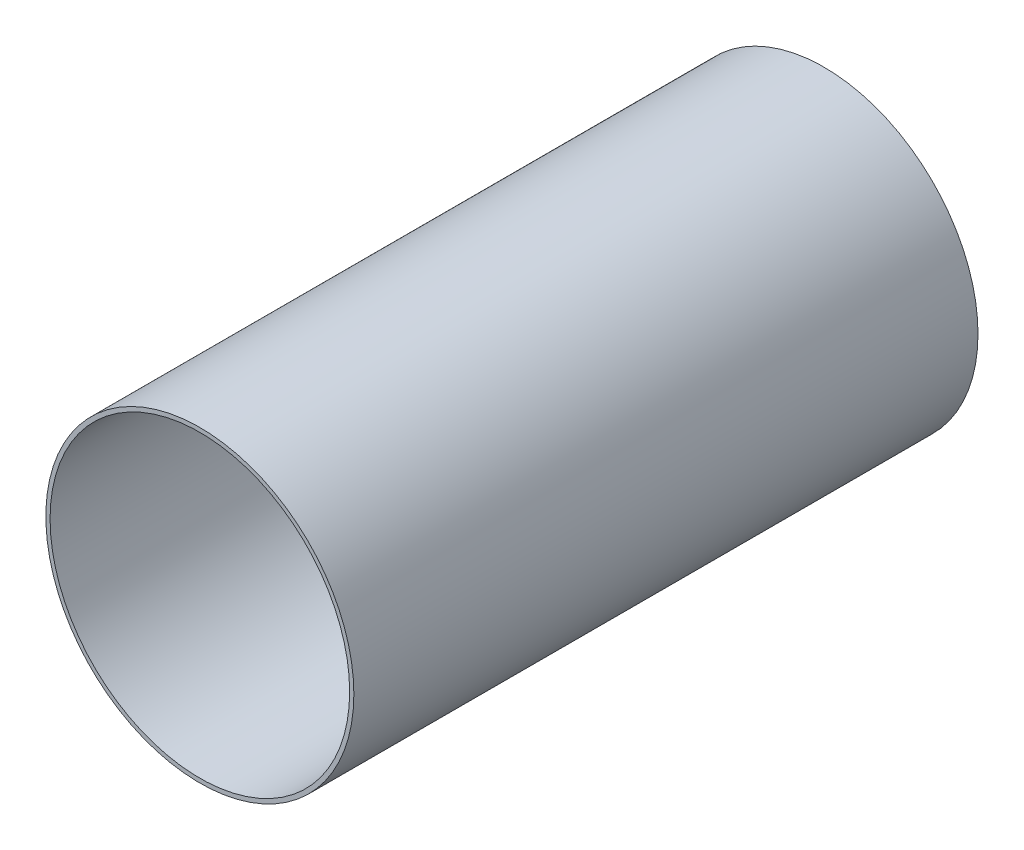
ISO-10303-21;
HEADER;
FILE_DESCRIPTION(('STEP AP214'),'2;1');
FILE_NAME('part.step','',(''),(''),'','','');
FILE_SCHEMA(('AUTOMOTIVE_DESIGN { 1 0 10303 214 1 1 1 1 }'));
ENDSEC;
DATA;
#1=APPLICATION_CONTEXT('core data for automotive mechanical design processes');
#2=APPLICATION_PROTOCOL_DEFINITION('international standard','automotive_design',2000,#1);
#3=PRODUCT_CONTEXT('',#1,'mechanical');
#4=PRODUCT('Part','Part','',(#3));
#5=PRODUCT_RELATED_PRODUCT_CATEGORY('part','',(#4));
#6=PRODUCT_DEFINITION_FORMATION('','',#4);
#7=PRODUCT_DEFINITION_CONTEXT('part definition',#1,'design');
#8=PRODUCT_DEFINITION('design','',#6,#7);
#9=PRODUCT_DEFINITION_SHAPE('','',#8);
#10=(LENGTH_UNIT() NAMED_UNIT(*) SI_UNIT(.MILLI.,.METRE.));
#11=(NAMED_UNIT(*) PLANE_ANGLE_UNIT() SI_UNIT($,.RADIAN.));
#12=(NAMED_UNIT(*) SI_UNIT($,.STERADIAN.) SOLID_ANGLE_UNIT());
#13=UNCERTAINTY_MEASURE_WITH_UNIT(LENGTH_MEASURE(1.E-05),#10,'distance_accuracy_value','');
#14=(GEOMETRIC_REPRESENTATION_CONTEXT(3) GLOBAL_UNCERTAINTY_ASSIGNED_CONTEXT((#13)) GLOBAL_UNIT_ASSIGNED_CONTEXT((#10,
#11,#12)) REPRESENTATION_CONTEXT('',''));
#15=CARTESIAN_POINT('',(0.,0.,0.));
#16=DIRECTION('',(0.,0.,1.));
#17=DIRECTION('',(1.,0.,0.));
#18=AXIS2_PLACEMENT_3D('',#15,#16,#17);
#19=CARTESIAN_POINT('',(0.,0.,200.));
#20=DIRECTION('',(0.,0.,1.));
#21=DIRECTION('',(1.,0.,0.));
#22=AXIS2_PLACEMENT_3D('',#19,#20,#21);
#23=PLANE('',#22);
#24=CARTESIAN_POINT('',(0.,0.,200.));
#25=DIRECTION('',(0.,0.,1.));
#26=DIRECTION('',(1.,0.,0.));
#27=AXIS2_PLACEMENT_3D('',#24,#25,#26);
#28=CIRCLE('',#27,49.35);
#29=CARTESIAN_POINT('',(49.35,0.,200.));
#30=VERTEX_POINT('',#29);
#31=EDGE_CURVE('E10',#30,#30,#28,.T.);
#32=ORIENTED_EDGE('',*,*,#31,.T.);
#33=EDGE_LOOP('',(#32));
#34=FACE_BOUND('',#33,.T.);
#35=CARTESIAN_POINT('',(0.,0.,200.));
#36=DIRECTION('',(0.,0.,1.));
#37=DIRECTION('',(1.,0.,0.));
#38=AXIS2_PLACEMENT_3D('',#35,#36,#37);
#39=CIRCLE('',#38,48.);
#40=CARTESIAN_POINT('',(48.,0.,200.));
#41=VERTEX_POINT('',#40);
#42=EDGE_CURVE('E56',#41,#41,#39,.T.);
#43=ORIENTED_EDGE('',*,*,#42,.F.);
#44=EDGE_LOOP('',(#43));
#45=FACE_BOUND('',#44,.T.);
#46=ADVANCED_FACE('F45',(#34,#45),#23,.T.);
#47=CARTESIAN_POINT('',(0.,0.,0.));
#48=DIRECTION('',(0.,0.,1.));
#49=DIRECTION('',(1.,0.,0.));
#50=AXIS2_PLACEMENT_3D('',#47,#48,#49);
#51=PLANE('',#50);
#52=CARTESIAN_POINT('',(0.,0.,0.));
#53=DIRECTION('',(0.,0.,1.));
#54=DIRECTION('',(1.,0.,0.));
#55=AXIS2_PLACEMENT_3D('',#52,#53,#54);
#56=CIRCLE('',#55,49.35);
#57=CARTESIAN_POINT('',(49.35,0.,0.));
#58=VERTEX_POINT('',#57);
#59=EDGE_CURVE('E49',#58,#58,#56,.T.);
#60=ORIENTED_EDGE('',*,*,#59,.F.);
#61=EDGE_LOOP('',(#60));
#62=FACE_BOUND('',#61,.T.);
#63=CARTESIAN_POINT('',(0.,0.,0.));
#64=DIRECTION('',(0.,0.,1.));
#65=DIRECTION('',(1.,0.,0.));
#66=AXIS2_PLACEMENT_3D('',#63,#64,#65);
#67=CIRCLE('',#66,48.);
#68=CARTESIAN_POINT('',(48.,0.,0.));
#69=VERTEX_POINT('',#68);
#70=EDGE_CURVE('E58',#69,#69,#67,.T.);
#71=ORIENTED_EDGE('',*,*,#70,.T.);
#72=EDGE_LOOP('',(#71));
#73=FACE_BOUND('',#72,.T.);
#74=ADVANCED_FACE('F68',(#62,#73),#51,.F.);
#75=CARTESIAN_POINT('',(0.,0.,200.));
#76=DIRECTION('',(0.,0.,-1.));
#77=DIRECTION('',(-1.,0.,0.));
#78=AXIS2_PLACEMENT_3D('',#75,#76,#77);
#79=CYLINDRICAL_SURFACE('',#78,49.35);
#80=ORIENTED_EDGE('',*,*,#31,.F.);
#81=EDGE_LOOP('',(#80));
#82=FACE_BOUND('',#81,.T.);
#83=ORIENTED_EDGE('',*,*,#59,.T.);
#84=EDGE_LOOP('',(#83));
#85=FACE_BOUND('',#84,.T.);
#86=ADVANCED_FACE('F47',(#82,#85),#79,.T.);
#87=CARTESIAN_POINT('',(0.,0.,200.));
#88=DIRECTION('',(0.,0.,-1.));
#89=DIRECTION('',(-1.,0.,0.));
#90=AXIS2_PLACEMENT_3D('',#87,#88,#89);
#91=CYLINDRICAL_SURFACE('',#90,48.);
#92=ORIENTED_EDGE('',*,*,#42,.T.);
#93=EDGE_LOOP('',(#92));
#94=FACE_BOUND('',#93,.T.);
#95=ORIENTED_EDGE('',*,*,#70,.F.);
#96=EDGE_LOOP('',(#95));
#97=FACE_BOUND('',#96,.T.);
#98=ADVANCED_FACE('F64',(#94,#97),#91,.F.);
#99=CLOSED_SHELL('',(#46,#74,#86,#98));
#100=MANIFOLD_SOLID_BREP('B2',#99);
#101=ADVANCED_BREP_SHAPE_REPRESENTATION('',(#18,#100),#14);
#102=SHAPE_DEFINITION_REPRESENTATION(#9,#101);
ENDSEC;
END-ISO-10303-21;
